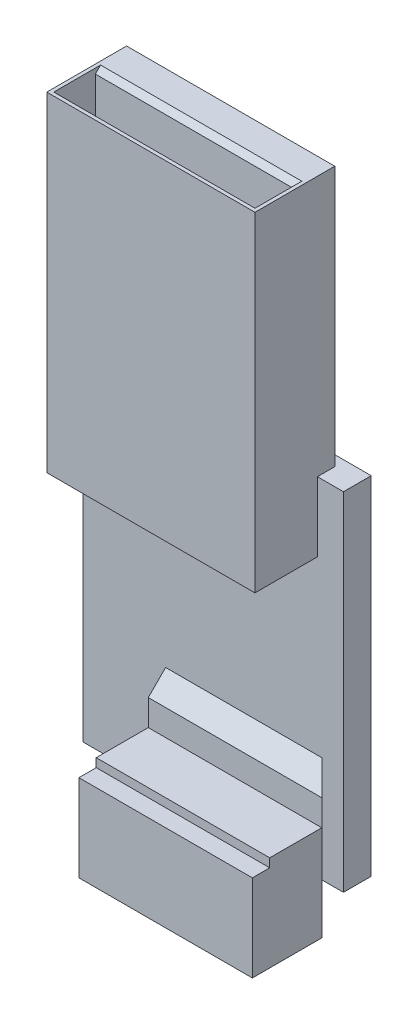
ISO-10303-21;
HEADER;
FILE_DESCRIPTION(('STEP AP214'),'2;1');
FILE_NAME('part.step','',(''),(''),'','','');
FILE_SCHEMA(('AUTOMOTIVE_DESIGN { 1 0 10303 214 1 1 1 1 }'));
ENDSEC;
DATA;
#1=APPLICATION_CONTEXT('core data for automotive mechanical design processes');
#2=APPLICATION_PROTOCOL_DEFINITION('international standard','automotive_design',2000,#1);
#3=PRODUCT_CONTEXT('',#1,'mechanical');
#4=PRODUCT('Part','Part','',(#3));
#5=PRODUCT_RELATED_PRODUCT_CATEGORY('part','',(#4));
#6=PRODUCT_DEFINITION_FORMATION('','',#4);
#7=PRODUCT_DEFINITION_CONTEXT('part definition',#1,'design');
#8=PRODUCT_DEFINITION('design','',#6,#7);
#9=PRODUCT_DEFINITION_SHAPE('','',#8);
#10=(LENGTH_UNIT() NAMED_UNIT(*) SI_UNIT(.MILLI.,.METRE.));
#11=(NAMED_UNIT(*) PLANE_ANGLE_UNIT() SI_UNIT($,.RADIAN.));
#12=(NAMED_UNIT(*) SI_UNIT($,.STERADIAN.) SOLID_ANGLE_UNIT());
#13=UNCERTAINTY_MEASURE_WITH_UNIT(LENGTH_MEASURE(1.E-05),#10,'distance_accuracy_value','');
#14=(GEOMETRIC_REPRESENTATION_CONTEXT(3) GLOBAL_UNCERTAINTY_ASSIGNED_CONTEXT((#13)) GLOBAL_UNIT_ASSIGNED_CONTEXT((#10,
#11,#12)) REPRESENTATION_CONTEXT('',''));
#15=CARTESIAN_POINT('',(0.,0.,0.));
#16=DIRECTION('',(0.,0.,1.));
#17=DIRECTION('',(1.,0.,0.));
#18=AXIS2_PLACEMENT_3D('',#15,#16,#17);
#19=CARTESIAN_POINT('',(0.,0.,1600.));
#20=DIRECTION('',(0.,0.,1.));
#21=DIRECTION('',(1.,0.,0.));
#22=AXIS2_PLACEMENT_3D('',#19,#20,#21);
#23=PLANE('',#22);
#24=DIRECTION('',(1.,0.,0.));
#25=VECTOR('',#24,1.);
#26=CARTESIAN_POINT('',(7500.,10000.,1600.));
#27=LINE('',#26,#25);
#28=CARTESIAN_POINT('',(6000.,10000.,1600.));
#29=VERTEX_POINT('',#28);
#30=CARTESIAN_POINT('',(7500.,10000.,1600.));
#31=VERTEX_POINT('',#30);
#32=EDGE_CURVE('E386',#29,#31,#27,.T.);
#33=ORIENTED_EDGE('',*,*,#32,.F.);
#34=DIRECTION('',(0.,1.,0.));
#35=VECTOR('',#34,1.);
#36=CARTESIAN_POINT('',(6000.,25000.,1600.));
#37=LINE('',#36,#35);
#38=CARTESIAN_POINT('',(6000.,6000.,1600.));
#39=VERTEX_POINT('',#38);
#40=EDGE_CURVE('E287',#39,#29,#37,.T.);
#41=ORIENTED_EDGE('',*,*,#40,.F.);
#42=DIRECTION('',(1.,0.,0.));
#43=VECTOR('',#42,1.);
#44=CARTESIAN_POINT('',(6000.,6000.,1600.));
#45=LINE('',#44,#43);
#46=CARTESIAN_POINT('',(-6000.,6000.,1600.));
#47=VERTEX_POINT('',#46);
#48=EDGE_CURVE('E264',#47,#39,#45,.T.);
#49=ORIENTED_EDGE('',*,*,#48,.F.);
#50=DIRECTION('',(0.,-1.,0.));
#51=VECTOR('',#50,1.);
#52=CARTESIAN_POINT('',(-6000.,6000.,1600.));
#53=LINE('',#52,#51);
#54=CARTESIAN_POINT('',(-6000.,10000.,1600.));
#55=VERTEX_POINT('',#54);
#56=EDGE_CURVE('E273',#55,#47,#53,.T.);
#57=ORIENTED_EDGE('',*,*,#56,.F.);
#58=CARTESIAN_POINT('',(-7500.,10000.,1600.));
#59=VERTEX_POINT('',#58);
#60=EDGE_CURVE('E381',#59,#55,#27,.T.);
#61=ORIENTED_EDGE('',*,*,#60,.F.);
#62=DIRECTION('',(0.,1.,0.));
#63=VECTOR('',#62,1.);
#64=CARTESIAN_POINT('',(-7500.,10000.,1600.));
#65=LINE('',#64,#63);
#66=CARTESIAN_POINT('',(-7500.,-10000.,1600.));
#67=VERTEX_POINT('',#66);
#68=EDGE_CURVE('E390',#67,#59,#65,.T.);
#69=ORIENTED_EDGE('',*,*,#68,.F.);
#70=DIRECTION('',(-1.,0.,0.));
#71=VECTOR('',#70,1.);
#72=CARTESIAN_POINT('',(-7500.,-10000.,1600.));
#73=LINE('',#72,#71);
#74=CARTESIAN_POINT('',(-2750.,-10000.,1600.));
#75=VERTEX_POINT('',#74);
#76=EDGE_CURVE('E455',#75,#67,#73,.T.);
#77=ORIENTED_EDGE('',*,*,#76,.F.);
#78=DIRECTION('',(0.,-1.,0.));
#79=VECTOR('',#78,1.);
#80=CARTESIAN_POINT('',(-2750.,-6400.,1600.));
#81=LINE('',#80,#79);
#82=CARTESIAN_POINT('',(-2750.,-3900.,1600.));
#83=VERTEX_POINT('',#82);
#84=EDGE_CURVE('E354',#83,#75,#81,.T.);
#85=ORIENTED_EDGE('',*,*,#84,.F.);
#86=DIRECTION('',(-1.,0.,0.));
#87=VECTOR('',#86,1.);
#88=CARTESIAN_POINT('',(-2750.,-3900.,1600.));
#89=LINE('',#88,#87);
#90=CARTESIAN_POINT('',(6250.,-3900.,1600.));
#91=VERTEX_POINT('',#90);
#92=EDGE_CURVE('E409',#91,#83,#89,.T.);
#93=ORIENTED_EDGE('',*,*,#92,.F.);
#94=DIRECTION('',(0.,-1.,0.));
#95=VECTOR('',#94,1.);
#96=CARTESIAN_POINT('',(6250.,-6400.,1600.));
#97=LINE('',#96,#95);
#98=CARTESIAN_POINT('',(6250.,-10000.,1600.));
#99=VERTEX_POINT('',#98);
#100=EDGE_CURVE('E364',#91,#99,#97,.T.);
#101=ORIENTED_EDGE('',*,*,#100,.T.);
#102=CARTESIAN_POINT('',(7500.,-10000.,1600.));
#103=VERTEX_POINT('',#102);
#104=EDGE_CURVE('E448',#103,#99,#73,.T.);
#105=ORIENTED_EDGE('',*,*,#104,.F.);
#106=DIRECTION('',(0.,-1.,0.));
#107=VECTOR('',#106,1.);
#108=CARTESIAN_POINT('',(7500.,-10000.,1600.));
#109=LINE('',#108,#107);
#110=EDGE_CURVE('E385',#31,#103,#109,.T.);
#111=ORIENTED_EDGE('',*,*,#110,.F.);
#112=EDGE_LOOP('',(#33,#41,#49,#57,#61,#69,#77,#85,#93,#101,#105,#111));
#113=FACE_BOUND('',#112,.T.);
#114=ADVANCED_FACE('F41',(#113),#23,.T.);
#115=CARTESIAN_POINT('',(7500.,10000.,0.));
#116=DIRECTION('',(0.,-1.,0.));
#117=DIRECTION('',(0.,0.,-1.));
#118=AXIS2_PLACEMENT_3D('',#115,#116,#117);
#119=PLANE('',#118);
#120=DIRECTION('',(0.,0.,1.));
#121=VECTOR('',#120,1.);
#122=CARTESIAN_POINT('',(-6000.,10000.,1600.));
#123=LINE('',#122,#121);
#124=CARTESIAN_POINT('',(-6000.,10000.,600.));
#125=VERTEX_POINT('',#124);
#126=EDGE_CURVE('E299',#125,#55,#123,.T.);
#127=ORIENTED_EDGE('',*,*,#126,.F.);
#128=DIRECTION('',(-1.,0.,0.));
#129=VECTOR('',#128,1.);
#130=CARTESIAN_POINT('',(-6000.,10000.,600.));
#131=LINE('',#130,#129);
#132=CARTESIAN_POINT('',(6000.,10000.,600.));
#133=VERTEX_POINT('',#132);
#134=EDGE_CURVE('E305',#133,#125,#131,.T.);
#135=ORIENTED_EDGE('',*,*,#134,.F.);
#136=DIRECTION('',(0.,0.,-1.));
#137=VECTOR('',#136,1.);
#138=CARTESIAN_POINT('',(6000.,10000.,600.));
#139=LINE('',#138,#137);
#140=EDGE_CURVE('E309',#29,#133,#139,.T.);
#141=ORIENTED_EDGE('',*,*,#140,.F.);
#142=ORIENTED_EDGE('',*,*,#32,.T.);
#143=DIRECTION('',(0.,0.,1.));
#144=VECTOR('',#143,1.);
#145=CARTESIAN_POINT('',(7500.,10000.,0.));
#146=LINE('',#145,#144);
#147=CARTESIAN_POINT('',(7500.,10000.,0.));
#148=VERTEX_POINT('',#147);
#149=EDGE_CURVE('E399',#148,#31,#146,.T.);
#150=ORIENTED_EDGE('',*,*,#149,.F.);
#151=DIRECTION('',(1.,0.,0.));
#152=VECTOR('',#151,1.);
#153=CARTESIAN_POINT('',(7500.,10000.,0.));
#154=LINE('',#153,#152);
#155=CARTESIAN_POINT('',(-7500.,10000.,-4.44089209850063E-13));
#156=VERTEX_POINT('',#155);
#157=EDGE_CURVE('E771',#156,#148,#154,.T.);
#158=ORIENTED_EDGE('',*,*,#157,.F.);
#159=DIRECTION('',(0.,0.,1.));
#160=VECTOR('',#159,1.);
#161=CARTESIAN_POINT('',(-7500.,10000.,-4.44089209850063E-13));
#162=LINE('',#161,#160);
#163=EDGE_CURVE('E403',#156,#59,#162,.T.);
#164=ORIENTED_EDGE('',*,*,#163,.T.);
#165=ORIENTED_EDGE('',*,*,#60,.T.);
#166=EDGE_LOOP('',(#127,#135,#141,#142,#150,#158,#164,#165));
#167=FACE_BOUND('',#166,.T.);
#168=ADVANCED_FACE('F492',(#167),#119,.F.);
#169=CARTESIAN_POINT('',(0.,-6400.,0.));
#170=DIRECTION('',(0.,-1.,0.));
#171=DIRECTION('',(0.,0.,-1.));
#172=AXIS2_PLACEMENT_3D('',#169,#170,#171);
#173=PLANE('',#172);
#174=DIRECTION('',(0.,0.,-1.));
#175=VECTOR('',#174,1.);
#176=CARTESIAN_POINT('',(-2750.,-6400.,6600.));
#177=LINE('',#176,#175);
#178=CARTESIAN_POINT('',(-2750.,-6400.,5600.));
#179=VERTEX_POINT('',#178);
#180=CARTESIAN_POINT('',(-2750.,-6400.,2600.));
#181=VERTEX_POINT('',#180);
#182=EDGE_CURVE('E324',#179,#181,#177,.T.);
#183=ORIENTED_EDGE('',*,*,#182,.F.);
#184=DIRECTION('',(-1.,0.,0.));
#185=VECTOR('',#184,1.);
#186=CARTESIAN_POINT('',(7500.000025,-6400.,5600.));
#187=LINE('',#186,#185);
#188=CARTESIAN_POINT('',(7250.,-6400.,5600.));
#189=VERTEX_POINT('',#188);
#190=EDGE_CURVE('E262',#189,#179,#187,.T.);
#191=ORIENTED_EDGE('',*,*,#190,.F.);
#192=DIRECTION('',(0.,0.,1.));
#193=VECTOR('',#192,1.);
#194=CARTESIAN_POINT('',(7250.,-6400.,2600.));
#195=LINE('',#194,#193);
#196=CARTESIAN_POINT('',(7250.,-6400.,2600.));
#197=VERTEX_POINT('',#196);
#198=EDGE_CURVE('E329',#197,#189,#195,.T.);
#199=ORIENTED_EDGE('',*,*,#198,.F.);
#200=DIRECTION('',(1.,0.,0.));
#201=VECTOR('',#200,1.);
#202=CARTESIAN_POINT('',(7250.,-6400.,2600.));
#203=LINE('',#202,#201);
#204=EDGE_CURVE('E367',#181,#197,#203,.T.);
#205=ORIENTED_EDGE('',*,*,#204,.F.);
#206=EDGE_LOOP('',(#183,#191,#199,#205));
#207=FACE_BOUND('',#206,.T.);
#208=ADVANCED_FACE('F428',(#207),#173,.F.);
#209=CARTESIAN_POINT('',(-2750.,-6400.,1600.));
#210=DIRECTION('',(0.,0.,-1.));
#211=DIRECTION('',(-1.,0.,0.));
#212=AXIS2_PLACEMENT_3D('',#209,#210,#211);
#213=PLANE('',#212);
#214=EDGE_CURVE('E322',#99,#75,#73,.T.);
#215=ORIENTED_EDGE('',*,*,#214,.F.);
#216=CARTESIAN_POINT('',(6250.,-11900.,1600.));
#217=VERTEX_POINT('',#216);
#218=EDGE_CURVE('E328',#99,#217,#97,.T.);
#219=ORIENTED_EDGE('',*,*,#218,.T.);
#220=DIRECTION('',(1.,0.,0.));
#221=VECTOR('',#220,1.);
#222=CARTESIAN_POINT('',(-2750.,-11900.,1600.));
#223=LINE('',#222,#221);
#224=CARTESIAN_POINT('',(-2750.,-11900.,1600.));
#225=VERTEX_POINT('',#224);
#226=EDGE_CURVE('E336',#225,#217,#223,.T.);
#227=ORIENTED_EDGE('',*,*,#226,.F.);
#228=EDGE_CURVE('E357',#75,#225,#81,.T.);
#229=ORIENTED_EDGE('',*,*,#228,.F.);
#230=EDGE_LOOP('',(#215,#219,#227,#229));
#231=FACE_BOUND('',#230,.T.);
#232=ADVANCED_FACE('F471',(#231),#213,.T.);
#233=CARTESIAN_POINT('',(-2750.,-6400.,6600.));
#234=DIRECTION('',(-1.,0.,0.));
#235=DIRECTION('',(0.,0.,1.));
#236=AXIS2_PLACEMENT_3D('',#233,#234,#235);
#237=PLANE('',#236);
#238=DIRECTION('',(0.,-1.,0.));
#239=VECTOR('',#238,1.);
#240=CARTESIAN_POINT('',(-2750.,-6400.,5600.));
#241=LINE('',#240,#239);
#242=CARTESIAN_POINT('',(-2750.,-6900.,5600.));
#243=VERTEX_POINT('',#242);
#244=EDGE_CURVE('E252',#179,#243,#241,.T.);
#245=ORIENTED_EDGE('',*,*,#244,.F.);
#246=ORIENTED_EDGE('',*,*,#182,.T.);
#247=DIRECTION('',(0.,-1.,0.));
#248=VECTOR('',#247,1.);
#249=CARTESIAN_POINT('',(-2750.,-3900.,2600.));
#250=LINE('',#249,#248);
#251=CARTESIAN_POINT('',(-2750.,-4900.00000000001,2600.));
#252=VERTEX_POINT('',#251);
#253=EDGE_CURVE('E374',#252,#181,#250,.T.);
#254=ORIENTED_EDGE('',*,*,#253,.F.);
#255=DIRECTION('',(0.,0.70710678118655,-0.707106781186545));
#256=VECTOR('',#255,1.);
#257=CARTESIAN_POINT('',(-2750.,-7650.00000000001,5349.99999999998));
#258=LINE('',#257,#256);
#259=EDGE_CURVE('E378',#83,#252,#258,.F.);
#260=ORIENTED_EDGE('',*,*,#259,.F.);
#261=ORIENTED_EDGE('',*,*,#84,.T.);
#262=ORIENTED_EDGE('',*,*,#228,.T.);
#263=DIRECTION('',(0.,0.,-1.));
#264=VECTOR('',#263,1.);
#265=CARTESIAN_POINT('',(-2750.,-11900.,6600.));
#266=LINE('',#265,#264);
#267=CARTESIAN_POINT('',(-2750.,-11900.,6600.));
#268=VERTEX_POINT('',#267);
#269=EDGE_CURVE('E350',#268,#225,#266,.T.);
#270=ORIENTED_EDGE('',*,*,#269,.F.);
#271=DIRECTION('',(0.,-1.,0.));
#272=VECTOR('',#271,1.);
#273=CARTESIAN_POINT('',(-2750.,-6400.,6600.));
#274=LINE('',#273,#272);
#275=CARTESIAN_POINT('',(-2750.,-6900.,6600.));
#276=VERTEX_POINT('',#275);
#277=EDGE_CURVE('E358',#276,#268,#274,.T.);
#278=ORIENTED_EDGE('',*,*,#277,.F.);
#279=DIRECTION('',(0.,0.,1.));
#280=VECTOR('',#279,1.);
#281=CARTESIAN_POINT('',(-2750.,-6900.,5600.));
#282=LINE('',#281,#280);
#283=EDGE_CURVE('E259',#243,#276,#282,.T.);
#284=ORIENTED_EDGE('',*,*,#283,.F.);
#285=EDGE_LOOP('',(#245,#246,#254,#260,#261,#262,#270,#278,#284));
#286=FACE_BOUND('',#285,.T.);
#287=ADVANCED_FACE('F467',(#286),#237,.T.);
#288=CARTESIAN_POINT('',(7250.,-6400.,6600.));
#289=DIRECTION('',(0.,0.,1.));
#290=DIRECTION('',(1.,0.,0.));
#291=AXIS2_PLACEMENT_3D('',#288,#289,#290);
#292=PLANE('',#291);
#293=DIRECTION('',(-1.,0.,0.));
#294=VECTOR('',#293,1.);
#295=CARTESIAN_POINT('',(7500.000025,-6900.,6600.));
#296=LINE('',#295,#294);
#297=CARTESIAN_POINT('',(7250.,-6900.,6600.));
#298=VERTEX_POINT('',#297);
#299=EDGE_CURVE('E265',#298,#276,#296,.T.);
#300=ORIENTED_EDGE('',*,*,#299,.T.);
#301=ORIENTED_EDGE('',*,*,#277,.T.);
#302=DIRECTION('',(-1.,0.,0.));
#303=VECTOR('',#302,1.);
#304=CARTESIAN_POINT('',(7250.,-11900.,6600.));
#305=LINE('',#304,#303);
#306=CARTESIAN_POINT('',(7250.,-11900.,6600.));
#307=VERTEX_POINT('',#306);
#308=EDGE_CURVE('E347',#307,#268,#305,.T.);
#309=ORIENTED_EDGE('',*,*,#308,.F.);
#310=DIRECTION('',(0.,-1.,0.));
#311=VECTOR('',#310,1.);
#312=CARTESIAN_POINT('',(7250.,-6400.,6600.));
#313=LINE('',#312,#311);
#314=EDGE_CURVE('E360',#298,#307,#313,.T.);
#315=ORIENTED_EDGE('',*,*,#314,.F.);
#316=EDGE_LOOP('',(#300,#301,#309,#315));
#317=FACE_BOUND('',#316,.T.);
#318=ADVANCED_FACE('F473',(#317),#292,.T.);
#319=CARTESIAN_POINT('',(7250.,-6400.,2600.));
#320=DIRECTION('',(1.,0.,0.));
#321=DIRECTION('',(0.,0.,-1.));
#322=AXIS2_PLACEMENT_3D('',#319,#320,#321);
#323=PLANE('',#322);
#324=DIRECTION('',(0.,1.,0.));
#325=VECTOR('',#324,1.);
#326=CARTESIAN_POINT('',(7250.,-6400.,5600.));
#327=LINE('',#326,#325);
#328=CARTESIAN_POINT('',(7250.,-6900.,5600.));
#329=VERTEX_POINT('',#328);
#330=EDGE_CURVE('E321',#329,#189,#327,.T.);
#331=ORIENTED_EDGE('',*,*,#330,.F.);
#332=DIRECTION('',(0.,0.,-1.));
#333=VECTOR('',#332,1.);
#334=CARTESIAN_POINT('',(7250.,-6900.,2600.));
#335=LINE('',#334,#333);
#336=EDGE_CURVE('E319',#298,#329,#335,.T.);
#337=ORIENTED_EDGE('',*,*,#336,.F.);
#338=ORIENTED_EDGE('',*,*,#314,.T.);
#339=DIRECTION('',(0.,0.,1.));
#340=VECTOR('',#339,1.);
#341=CARTESIAN_POINT('',(7250.,-11900.,2600.));
#342=LINE('',#341,#340);
#343=CARTESIAN_POINT('',(7250.,-11900.,2600.));
#344=VERTEX_POINT('',#343);
#345=EDGE_CURVE('E344',#344,#307,#342,.T.);
#346=ORIENTED_EDGE('',*,*,#345,.F.);
#347=DIRECTION('',(0.,-1.,0.));
#348=VECTOR('',#347,1.);
#349=CARTESIAN_POINT('',(7250.,-6400.,2600.));
#350=LINE('',#349,#348);
#351=EDGE_CURVE('E362',#197,#344,#350,.T.);
#352=ORIENTED_EDGE('',*,*,#351,.F.);
#353=ORIENTED_EDGE('',*,*,#198,.T.);
#354=EDGE_LOOP('',(#331,#337,#338,#346,#352,#353));
#355=FACE_BOUND('',#354,.T.);
#356=ADVANCED_FACE('F433',(#355),#323,.T.);
#357=CARTESIAN_POINT('',(6250.,-6400.,1600.));
#358=DIRECTION('',(0.707106781186548,0.,-0.707106781186548));
#359=DIRECTION('',(-0.707106781186548,0.,-0.707106781186548));
#360=AXIS2_PLACEMENT_3D('',#357,#358,#359);
#361=PLANE('',#360);
#362=DIRECTION('',(0.707106781186547,0.,0.707106781186547));
#363=VECTOR('',#362,1.);
#364=CARTESIAN_POINT('',(6250.,-11900.,1600.));
#365=LINE('',#364,#363);
#366=EDGE_CURVE('E340',#217,#344,#365,.T.);
#367=ORIENTED_EDGE('',*,*,#366,.F.);
#368=ORIENTED_EDGE('',*,*,#218,.F.);
#369=ORIENTED_EDGE('',*,*,#100,.F.);
#370=DIRECTION('',(0.577350269189625,-0.577350269189629,0.577350269189625));
#371=VECTOR('',#370,1.);
#372=CARTESIAN_POINT('',(7083.33333333334,-4733.33333333334,2433.33333333334));
#373=LINE('',#372,#371);
#374=CARTESIAN_POINT('',(7250.,-4900.00000000001,2600.));
#375=VERTEX_POINT('',#374);
#376=EDGE_CURVE('E411',#375,#91,#373,.F.);
#377=ORIENTED_EDGE('',*,*,#376,.F.);
#378=DIRECTION('',(0.,-1.,0.));
#379=VECTOR('',#378,1.);
#380=CARTESIAN_POINT('',(7250.,-3900.,2600.));
#381=LINE('',#380,#379);
#382=EDGE_CURVE('E341',#375,#197,#381,.T.);
#383=ORIENTED_EDGE('',*,*,#382,.T.);
#384=ORIENTED_EDGE('',*,*,#351,.T.);
#385=EDGE_LOOP('',(#367,#368,#369,#377,#383,#384));
#386=FACE_BOUND('',#385,.T.);
#387=ADVANCED_FACE('F416',(#386),#361,.T.);
#388=CARTESIAN_POINT('',(0.,-11900.,0.));
#389=DIRECTION('',(0.,-1.,0.));
#390=DIRECTION('',(0.,0.,-1.));
#391=AXIS2_PLACEMENT_3D('',#388,#389,#390);
#392=PLANE('',#391);
#393=ORIENTED_EDGE('',*,*,#226,.T.);
#394=ORIENTED_EDGE('',*,*,#366,.T.);
#395=ORIENTED_EDGE('',*,*,#345,.T.);
#396=ORIENTED_EDGE('',*,*,#308,.T.);
#397=ORIENTED_EDGE('',*,*,#269,.T.);
#398=EDGE_LOOP('',(#393,#394,#395,#396,#397));
#399=FACE_BOUND('',#398,.T.);
#400=ADVANCED_FACE('F438',(#399),#392,.T.);
#401=CARTESIAN_POINT('',(7250.,-3900.,2600.));
#402=DIRECTION('',(0.,0.,-1.));
#403=DIRECTION('',(-1.,0.,0.));
#404=AXIS2_PLACEMENT_3D('',#401,#402,#403);
#405=PLANE('',#404);
#406=ORIENTED_EDGE('',*,*,#204,.T.);
#407=ORIENTED_EDGE('',*,*,#382,.F.);
#408=DIRECTION('',(-1.,0.,0.));
#409=VECTOR('',#408,1.);
#410=CARTESIAN_POINT('',(-2750.,-4900.00000000001,2600.));
#411=LINE('',#410,#409);
#412=EDGE_CURVE('E330',#252,#375,#411,.F.);
#413=ORIENTED_EDGE('',*,*,#412,.F.);
#414=ORIENTED_EDGE('',*,*,#253,.T.);
#415=EDGE_LOOP('',(#406,#407,#413,#414));
#416=FACE_BOUND('',#415,.T.);
#417=ADVANCED_FACE('F424',(#416),#405,.F.);
#418=CARTESIAN_POINT('',(-2750.,-3900.,1600.));
#419=DIRECTION('',(0.,0.707106781186545,0.70710678118655));
#420=DIRECTION('',(0.,-0.70710678118655,0.707106781186545));
#421=AXIS2_PLACEMENT_3D('',#418,#419,#420);
#422=PLANE('',#421);
#423=ORIENTED_EDGE('',*,*,#412,.T.);
#424=ORIENTED_EDGE('',*,*,#376,.T.);
#425=ORIENTED_EDGE('',*,*,#92,.T.);
#426=ORIENTED_EDGE('',*,*,#259,.T.);
#427=EDGE_LOOP('',(#423,#424,#425,#426));
#428=FACE_BOUND('',#427,.T.);
#429=ADVANCED_FACE('F513',(#428),#422,.T.);
#430=CARTESIAN_POINT('',(-7500.,-10000.,-4.44089209850063E-13));
#431=DIRECTION('',(0.,1.,0.));
#432=DIRECTION('',(0.,0.,1.));
#433=AXIS2_PLACEMENT_3D('',#430,#431,#432);
#434=PLANE('',#433);
#435=ORIENTED_EDGE('',*,*,#104,.T.);
#436=ORIENTED_EDGE('',*,*,#214,.T.);
#437=ORIENTED_EDGE('',*,*,#76,.T.);
#438=DIRECTION('',(0.,0.,1.));
#439=VECTOR('',#438,1.);
#440=CARTESIAN_POINT('',(-7500.,-10000.,-4.44089209850063E-13));
#441=LINE('',#440,#439);
#442=CARTESIAN_POINT('',(-7500.,-10000.,-4.44089209850063E-13));
#443=VERTEX_POINT('',#442);
#444=EDGE_CURVE('E371',#443,#67,#441,.T.);
#445=ORIENTED_EDGE('',*,*,#444,.F.);
#446=DIRECTION('',(-1.,0.,0.));
#447=VECTOR('',#446,1.);
#448=CARTESIAN_POINT('',(-7500.,-10000.,-4.44089209850063E-13));
#449=LINE('',#448,#447);
#450=CARTESIAN_POINT('',(7500.,-10000.,0.));
#451=VERTEX_POINT('',#450);
#452=EDGE_CURVE('E395',#451,#443,#449,.T.);
#453=ORIENTED_EDGE('',*,*,#452,.F.);
#454=DIRECTION('',(0.,0.,1.));
#455=VECTOR('',#454,1.);
#456=CARTESIAN_POINT('',(7500.,-10000.,0.));
#457=LINE('',#456,#455);
#458=EDGE_CURVE('E396',#451,#103,#457,.T.);
#459=ORIENTED_EDGE('',*,*,#458,.T.);
#460=EDGE_LOOP('',(#435,#436,#437,#445,#453,#459));
#461=FACE_BOUND('',#460,.T.);
#462=ADVANCED_FACE('F452',(#461),#434,.F.);
#463=CARTESIAN_POINT('',(-7500.,10000.,-4.44089209850063E-13));
#464=DIRECTION('',(1.,0.,0.));
#465=DIRECTION('',(0.,0.,-1.));
#466=AXIS2_PLACEMENT_3D('',#463,#464,#465);
#467=PLANE('',#466);
#468=ORIENTED_EDGE('',*,*,#68,.T.);
#469=ORIENTED_EDGE('',*,*,#163,.F.);
#470=DIRECTION('',(0.,1.,0.));
#471=VECTOR('',#470,1.);
#472=CARTESIAN_POINT('',(-7500.,10000.,-4.44089209850063E-13));
#473=LINE('',#472,#471);
#474=EDGE_CURVE('E765',#443,#156,#473,.T.);
#475=ORIENTED_EDGE('',*,*,#474,.F.);
#476=ORIENTED_EDGE('',*,*,#444,.T.);
#477=EDGE_LOOP('',(#468,#469,#475,#476));
#478=FACE_BOUND('',#477,.T.);
#479=ADVANCED_FACE('F505',(#478),#467,.F.);
#480=CARTESIAN_POINT('',(7500.,-10000.,0.));
#481=DIRECTION('',(-1.,0.,0.));
#482=DIRECTION('',(0.,-1.,0.));
#483=AXIS2_PLACEMENT_3D('',#480,#481,#482);
#484=PLANE('',#483);
#485=ORIENTED_EDGE('',*,*,#110,.T.);
#486=ORIENTED_EDGE('',*,*,#458,.F.);
#487=DIRECTION('',(0.,-1.,0.));
#488=VECTOR('',#487,1.);
#489=CARTESIAN_POINT('',(7500.,-10000.,0.));
#490=LINE('',#489,#488);
#491=EDGE_CURVE('E400',#148,#451,#490,.T.);
#492=ORIENTED_EDGE('',*,*,#491,.F.);
#493=ORIENTED_EDGE('',*,*,#149,.T.);
#494=EDGE_LOOP('',(#485,#486,#492,#493));
#495=FACE_BOUND('',#494,.T.);
#496=ADVANCED_FACE('F503',(#495),#484,.F.);
#497=CARTESIAN_POINT('',(0.,0.,-2.22044604925031E-13));
#498=DIRECTION('',(0.,0.,1.));
#499=DIRECTION('',(1.,0.,0.));
#500=AXIS2_PLACEMENT_3D('',#497,#498,#499);
#501=PLANE('',#500);
#502=ORIENTED_EDGE('',*,*,#452,.T.);
#503=ORIENTED_EDGE('',*,*,#474,.T.);
#504=ORIENTED_EDGE('',*,*,#157,.T.);
#505=ORIENTED_EDGE('',*,*,#491,.T.);
#506=EDGE_LOOP('',(#502,#503,#504,#505));
#507=FACE_BOUND('',#506,.T.);
#508=ADVANCED_FACE('F501',(#507),#501,.F.);
#509=CARTESIAN_POINT('',(6000.,25000.,600.));
#510=DIRECTION('',(-1.,0.,0.));
#511=DIRECTION('',(0.,0.,1.));
#512=AXIS2_PLACEMENT_3D('',#509,#510,#511);
#513=PLANE('',#512);
#514=ORIENTED_EDGE('',*,*,#140,.T.);
#515=DIRECTION('',(0.,-1.,0.));
#516=VECTOR('',#515,1.);
#517=CARTESIAN_POINT('',(6000.,25000.,600.));
#518=LINE('',#517,#516);
#519=CARTESIAN_POINT('',(6000.,25000.,600.));
#520=VERTEX_POINT('',#519);
#521=EDGE_CURVE('E458',#520,#133,#518,.T.);
#522=ORIENTED_EDGE('',*,*,#521,.F.);
#523=DIRECTION('',(0.,0.,-1.));
#524=VECTOR('',#523,1.);
#525=CARTESIAN_POINT('',(6000.,25000.,600.));
#526=LINE('',#525,#524);
#527=CARTESIAN_POINT('',(6000.,25000.,5200.));
#528=VERTEX_POINT('',#527);
#529=EDGE_CURVE('E296',#528,#520,#526,.T.);
#530=ORIENTED_EDGE('',*,*,#529,.F.);
#531=DIRECTION('',(0.,1.,0.));
#532=VECTOR('',#531,1.);
#533=CARTESIAN_POINT('',(6000.,25000.,5200.));
#534=LINE('',#533,#532);
#535=CARTESIAN_POINT('',(6000.,6000.,5200.));
#536=VERTEX_POINT('',#535);
#537=EDGE_CURVE('E272',#536,#528,#534,.T.);
#538=ORIENTED_EDGE('',*,*,#537,.F.);
#539=DIRECTION('',(0.,0.,-1.));
#540=VECTOR('',#539,1.);
#541=CARTESIAN_POINT('',(6000.,6000.,5200.));
#542=LINE('',#541,#540);
#543=EDGE_CURVE('E785',#536,#39,#542,.T.);
#544=ORIENTED_EDGE('',*,*,#543,.T.);
#545=ORIENTED_EDGE('',*,*,#40,.T.);
#546=EDGE_LOOP('',(#514,#522,#530,#538,#544,#545));
#547=FACE_BOUND('',#546,.T.);
#548=ADVANCED_FACE('F690',(#547),#513,.F.);
#549=CARTESIAN_POINT('',(-6000.,25000.,600.));
#550=DIRECTION('',(0.,0.,1.));
#551=DIRECTION('',(1.,0.,0.));
#552=AXIS2_PLACEMENT_3D('',#549,#550,#551);
#553=PLANE('',#552);
#554=ORIENTED_EDGE('',*,*,#134,.T.);
#555=DIRECTION('',(0.,-1.,0.));
#556=VECTOR('',#555,1.);
#557=CARTESIAN_POINT('',(-6000.,25000.,600.));
#558=LINE('',#557,#556);
#559=CARTESIAN_POINT('',(-6000.,25000.,600.));
#560=VERTEX_POINT('',#559);
#561=EDGE_CURVE('E304',#560,#125,#558,.T.);
#562=ORIENTED_EDGE('',*,*,#561,.F.);
#563=DIRECTION('',(-1.,0.,0.));
#564=VECTOR('',#563,1.);
#565=CARTESIAN_POINT('',(-6000.,25000.,600.));
#566=LINE('',#565,#564);
#567=EDGE_CURVE('E298',#520,#560,#566,.T.);
#568=ORIENTED_EDGE('',*,*,#567,.F.);
#569=ORIENTED_EDGE('',*,*,#521,.T.);
#570=EDGE_LOOP('',(#554,#562,#568,#569));
#571=FACE_BOUND('',#570,.T.);
#572=ADVANCED_FACE('F682',(#571),#553,.F.);
#573=CARTESIAN_POINT('',(-6000.,25000.,1600.));
#574=DIRECTION('',(1.,0.,0.));
#575=DIRECTION('',(0.,0.,-1.));
#576=AXIS2_PLACEMENT_3D('',#573,#574,#575);
#577=PLANE('',#576);
#578=ORIENTED_EDGE('',*,*,#126,.T.);
#579=ORIENTED_EDGE('',*,*,#56,.T.);
#580=DIRECTION('',(0.,0.,-1.));
#581=VECTOR('',#580,1.);
#582=CARTESIAN_POINT('',(-6000.,6000.,5200.));
#583=LINE('',#582,#581);
#584=CARTESIAN_POINT('',(-6000.,6000.,5200.));
#585=VERTEX_POINT('',#584);
#586=EDGE_CURVE('E283',#585,#47,#583,.T.);
#587=ORIENTED_EDGE('',*,*,#586,.F.);
#588=DIRECTION('',(0.,-1.,0.));
#589=VECTOR('',#588,1.);
#590=CARTESIAN_POINT('',(-6000.,6000.,5200.));
#591=LINE('',#590,#589);
#592=CARTESIAN_POINT('',(-6000.,25000.,5200.));
#593=VERTEX_POINT('',#592);
#594=EDGE_CURVE('E280',#593,#585,#591,.T.);
#595=ORIENTED_EDGE('',*,*,#594,.F.);
#596=DIRECTION('',(0.,0.,1.));
#597=VECTOR('',#596,1.);
#598=CARTESIAN_POINT('',(-6000.,25000.,1600.));
#599=LINE('',#598,#597);
#600=EDGE_CURVE('E301',#560,#593,#599,.T.);
#601=ORIENTED_EDGE('',*,*,#600,.F.);
#602=ORIENTED_EDGE('',*,*,#561,.T.);
#603=EDGE_LOOP('',(#578,#579,#587,#595,#601,#602));
#604=FACE_BOUND('',#603,.T.);
#605=ADVANCED_FACE('F591',(#604),#577,.F.);
#606=CARTESIAN_POINT('',(0.,25000.,0.));
#607=DIRECTION('',(0.,-1.,0.));
#608=DIRECTION('',(0.,0.,-1.));
#609=AXIS2_PLACEMENT_3D('',#606,#607,#608);
#610=PLANE('',#609);
#611=DIRECTION('',(0.,0.,1.));
#612=VECTOR('',#611,1.);
#613=CARTESIAN_POINT('',(-5800.,25000.,2600.));
#614=LINE('',#613,#612);
#615=CARTESIAN_POINT('',(-5800.,25000.,2300.));
#616=VERTEX_POINT('',#615);
#617=CARTESIAN_POINT('',(-5800.,25000.,5000.));
#618=VERTEX_POINT('',#617);
#619=EDGE_CURVE('E56',#616,#618,#614,.T.);
#620=ORIENTED_EDGE('',*,*,#619,.F.);
#621=DIRECTION('',(1.,0.,0.));
#622=VECTOR('',#621,1.);
#623=CARTESIAN_POINT('',(0.,25000.,2300.));
#624=LINE('',#623,#622);
#625=CARTESIAN_POINT('',(5800.,25000.,2300.));
#626=VERTEX_POINT('',#625);
#627=EDGE_CURVE('E537',#616,#626,#624,.T.);
#628=ORIENTED_EDGE('',*,*,#627,.T.);
#629=DIRECTION('',(0.,0.,-1.));
#630=VECTOR('',#629,1.);
#631=CARTESIAN_POINT('',(5800.,25000.,5000.));
#632=LINE('',#631,#630);
#633=CARTESIAN_POINT('',(5800.,25000.,5000.));
#634=VERTEX_POINT('',#633);
#635=EDGE_CURVE('E63',#634,#626,#632,.T.);
#636=ORIENTED_EDGE('',*,*,#635,.F.);
#637=DIRECTION('',(1.,0.,0.));
#638=VECTOR('',#637,1.);
#639=CARTESIAN_POINT('',(-5800.,25000.,5000.));
#640=LINE('',#639,#638);
#641=EDGE_CURVE('E239',#618,#634,#640,.T.);
#642=ORIENTED_EDGE('',*,*,#641,.F.);
#643=EDGE_LOOP('',(#620,#628,#636,#642));
#644=FACE_BOUND('',#643,.T.);
#645=ORIENTED_EDGE('',*,*,#600,.T.);
#646=DIRECTION('',(-1.,0.,0.));
#647=VECTOR('',#646,1.);
#648=CARTESIAN_POINT('',(-6000.,25000.,5200.));
#649=LINE('',#648,#647);
#650=EDGE_CURVE('E276',#528,#593,#649,.T.);
#651=ORIENTED_EDGE('',*,*,#650,.F.);
#652=ORIENTED_EDGE('',*,*,#529,.T.);
#653=ORIENTED_EDGE('',*,*,#567,.T.);
#654=EDGE_LOOP('',(#645,#651,#652,#653));
#655=FACE_BOUND('',#654,.T.);
#656=ADVANCED_FACE('F541',(#644,#655),#610,.F.);
#657=CARTESIAN_POINT('',(6000.,6000.,5200.));
#658=DIRECTION('',(0.,1.,0.));
#659=DIRECTION('',(0.,0.,1.));
#660=AXIS2_PLACEMENT_3D('',#657,#658,#659);
#661=PLANE('',#660);
#662=ORIENTED_EDGE('',*,*,#48,.T.);
#663=ORIENTED_EDGE('',*,*,#543,.F.);
#664=DIRECTION('',(1.,0.,0.));
#665=VECTOR('',#664,1.);
#666=CARTESIAN_POINT('',(6000.,6000.,5200.));
#667=LINE('',#666,#665);
#668=EDGE_CURVE('E269',#585,#536,#667,.T.);
#669=ORIENTED_EDGE('',*,*,#668,.F.);
#670=ORIENTED_EDGE('',*,*,#586,.T.);
#671=EDGE_LOOP('',(#662,#663,#669,#670));
#672=FACE_BOUND('',#671,.T.);
#673=ADVANCED_FACE('F488',(#672),#661,.F.);
#674=CARTESIAN_POINT('',(0.,0.,5200.));
#675=DIRECTION('',(0.,0.,-1.));
#676=DIRECTION('',(-1.,0.,0.));
#677=AXIS2_PLACEMENT_3D('',#674,#675,#676);
#678=PLANE('',#677);
#679=ORIENTED_EDGE('',*,*,#668,.T.);
#680=ORIENTED_EDGE('',*,*,#537,.T.);
#681=ORIENTED_EDGE('',*,*,#650,.T.);
#682=ORIENTED_EDGE('',*,*,#594,.T.);
#683=EDGE_LOOP('',(#679,#680,#681,#682));
#684=FACE_BOUND('',#683,.T.);
#685=ADVANCED_FACE('F481',(#684),#678,.F.);
#686=CARTESIAN_POINT('',(7500.000025,-6400.,5600.));
#687=DIRECTION('',(0.,0.,-1.));
#688=DIRECTION('',(-1.,0.,0.));
#689=AXIS2_PLACEMENT_3D('',#686,#687,#688);
#690=PLANE('',#689);
#691=ORIENTED_EDGE('',*,*,#330,.T.);
#692=ORIENTED_EDGE('',*,*,#190,.T.);
#693=ORIENTED_EDGE('',*,*,#244,.T.);
#694=DIRECTION('',(-1.,0.,0.));
#695=VECTOR('',#694,1.);
#696=CARTESIAN_POINT('',(7500.000025,-6900.,5600.));
#697=LINE('',#696,#695);
#698=EDGE_CURVE('E261',#329,#243,#697,.T.);
#699=ORIENTED_EDGE('',*,*,#698,.F.);
#700=EDGE_LOOP('',(#691,#692,#693,#699));
#701=FACE_BOUND('',#700,.T.);
#702=ADVANCED_FACE('F479',(#701),#690,.F.);
#703=CARTESIAN_POINT('',(7500.000025,-6900.,5600.));
#704=DIRECTION('',(0.,-1.,0.));
#705=DIRECTION('',(0.,0.,-1.));
#706=AXIS2_PLACEMENT_3D('',#703,#704,#705);
#707=PLANE('',#706);
#708=ORIENTED_EDGE('',*,*,#336,.T.);
#709=ORIENTED_EDGE('',*,*,#698,.T.);
#710=ORIENTED_EDGE('',*,*,#283,.T.);
#711=ORIENTED_EDGE('',*,*,#299,.F.);
#712=EDGE_LOOP('',(#708,#709,#710,#711));
#713=FACE_BOUND('',#712,.T.);
#714=ADVANCED_FACE('F476',(#713),#707,.F.);
#715=CARTESIAN_POINT('',(5800.,15500.,2600.));
#716=DIRECTION('',(0.,0.,-1.));
#717=DIRECTION('',(-1.,0.,0.));
#718=AXIS2_PLACEMENT_3D('',#715,#716,#717);
#719=PLANE('',#718);
#720=DIRECTION('',(0.,1.,0.));
#721=VECTOR('',#720,1.);
#722=CARTESIAN_POINT('',(5800.,15500.,2600.));
#723=LINE('',#722,#721);
#724=CARTESIAN_POINT('',(5800.,15500.,2600.));
#725=VERTEX_POINT('',#724);
#726=CARTESIAN_POINT('',(5800.,24700.,2600.));
#727=VERTEX_POINT('',#726);
#728=EDGE_CURVE('E250',#725,#727,#723,.T.);
#729=ORIENTED_EDGE('',*,*,#728,.T.);
#730=DIRECTION('',(-1.,0.,0.));
#731=VECTOR('',#730,1.);
#732=CARTESIAN_POINT('',(5800.,24700.,2600.));
#733=LINE('',#732,#731);
#734=CARTESIAN_POINT('',(-5800.,24700.,2600.));
#735=VERTEX_POINT('',#734);
#736=EDGE_CURVE('E221',#727,#735,#733,.T.);
#737=ORIENTED_EDGE('',*,*,#736,.T.);
#738=DIRECTION('',(0.,1.,0.));
#739=VECTOR('',#738,1.);
#740=CARTESIAN_POINT('',(-5800.,15500.,2600.));
#741=LINE('',#740,#739);
#742=CARTESIAN_POINT('',(-5800.,15500.,2600.));
#743=VERTEX_POINT('',#742);
#744=EDGE_CURVE('E213',#743,#735,#741,.T.);
#745=ORIENTED_EDGE('',*,*,#744,.F.);
#746=DIRECTION('',(-1.,0.,0.));
#747=VECTOR('',#746,1.);
#748=CARTESIAN_POINT('',(5800.,15500.,2600.));
#749=LINE('',#748,#747);
#750=EDGE_CURVE('E218',#725,#743,#749,.T.);
#751=ORIENTED_EDGE('',*,*,#750,.F.);
#752=EDGE_LOOP('',(#729,#737,#745,#751));
#753=FACE_BOUND('',#752,.T.);
#754=ADVANCED_FACE('F216',(#753),#719,.F.);
#755=CARTESIAN_POINT('',(5800.,15500.,5000.));
#756=DIRECTION('',(1.,0.,0.));
#757=DIRECTION('',(0.,0.,-1.));
#758=AXIS2_PLACEMENT_3D('',#755,#756,#757);
#759=PLANE('',#758);
#760=ORIENTED_EDGE('',*,*,#635,.T.);
#761=DIRECTION('',(0.,0.707106781186552,-0.707106781186543));
#762=VECTOR('',#761,1.);
#763=CARTESIAN_POINT('',(5800.,18899.9999999999,8399.99999999999));
#764=LINE('',#763,#762);
#765=EDGE_CURVE('E11',#626,#727,#764,.F.);
#766=ORIENTED_EDGE('',*,*,#765,.T.);
#767=ORIENTED_EDGE('',*,*,#728,.F.);
#768=DIRECTION('',(0.,0.,-1.));
#769=VECTOR('',#768,1.);
#770=CARTESIAN_POINT('',(5800.,15500.,5000.));
#771=LINE('',#770,#769);
#772=CARTESIAN_POINT('',(5800.,15500.,5000.));
#773=VERTEX_POINT('',#772);
#774=EDGE_CURVE('E225',#773,#725,#771,.T.);
#775=ORIENTED_EDGE('',*,*,#774,.F.);
#776=DIRECTION('',(0.,1.,0.));
#777=VECTOR('',#776,1.);
#778=CARTESIAN_POINT('',(5800.,15500.,5000.));
#779=LINE('',#778,#777);
#780=EDGE_CURVE('E253',#773,#634,#779,.T.);
#781=ORIENTED_EDGE('',*,*,#780,.T.);
#782=EDGE_LOOP('',(#760,#766,#767,#775,#781));
#783=FACE_BOUND('',#782,.T.);
#784=ADVANCED_FACE('F545',(#783),#759,.F.);
#785=CARTESIAN_POINT('',(-5800.,15500.,5000.));
#786=DIRECTION('',(0.,0.,1.));
#787=DIRECTION('',(1.,0.,0.));
#788=AXIS2_PLACEMENT_3D('',#785,#786,#787);
#789=PLANE('',#788);
#790=ORIENTED_EDGE('',*,*,#641,.T.);
#791=ORIENTED_EDGE('',*,*,#780,.F.);
#792=DIRECTION('',(1.,0.,0.));
#793=VECTOR('',#792,1.);
#794=CARTESIAN_POINT('',(-5800.,15500.,5000.));
#795=LINE('',#794,#793);
#796=CARTESIAN_POINT('',(-5800.,15500.,5000.));
#797=VERTEX_POINT('',#796);
#798=EDGE_CURVE('E234',#797,#773,#795,.T.);
#799=ORIENTED_EDGE('',*,*,#798,.F.);
#800=DIRECTION('',(0.,1.,0.));
#801=VECTOR('',#800,1.);
#802=CARTESIAN_POINT('',(-5800.,15500.,5000.));
#803=LINE('',#802,#801);
#804=EDGE_CURVE('E224',#797,#618,#803,.T.);
#805=ORIENTED_EDGE('',*,*,#804,.T.);
#806=EDGE_LOOP('',(#790,#791,#799,#805));
#807=FACE_BOUND('',#806,.T.);
#808=ADVANCED_FACE('F544',(#807),#789,.F.);
#809=CARTESIAN_POINT('',(-5800.,15500.,2600.));
#810=DIRECTION('',(-1.,0.,0.));
#811=DIRECTION('',(0.,0.,1.));
#812=AXIS2_PLACEMENT_3D('',#809,#810,#811);
#813=PLANE('',#812);
#814=ORIENTED_EDGE('',*,*,#619,.T.);
#815=ORIENTED_EDGE('',*,*,#804,.F.);
#816=DIRECTION('',(0.,0.,1.));
#817=VECTOR('',#816,1.);
#818=CARTESIAN_POINT('',(-5800.,15500.,2600.));
#819=LINE('',#818,#817);
#820=EDGE_CURVE('E228',#743,#797,#819,.T.);
#821=ORIENTED_EDGE('',*,*,#820,.F.);
#822=ORIENTED_EDGE('',*,*,#744,.T.);
#823=DIRECTION('',(0.,-0.707106781186552,0.707106781186543));
#824=VECTOR('',#823,1.);
#825=CARTESIAN_POINT('',(-5800.,20099.9999999999,7200.));
#826=LINE('',#825,#824);
#827=EDGE_CURVE('E49',#735,#616,#826,.F.);
#828=ORIENTED_EDGE('',*,*,#827,.T.);
#829=EDGE_LOOP('',(#814,#815,#821,#822,#828));
#830=FACE_BOUND('',#829,.T.);
#831=ADVANCED_FACE('F229',(#830),#813,.F.);
#832=CARTESIAN_POINT('',(0.,15500.,0.));
#833=DIRECTION('',(0.,1.,0.));
#834=DIRECTION('',(0.,0.,1.));
#835=AXIS2_PLACEMENT_3D('',#832,#833,#834);
#836=PLANE('',#835);
#837=ORIENTED_EDGE('',*,*,#750,.T.);
#838=ORIENTED_EDGE('',*,*,#820,.T.);
#839=ORIENTED_EDGE('',*,*,#798,.T.);
#840=ORIENTED_EDGE('',*,*,#774,.T.);
#841=EDGE_LOOP('',(#837,#838,#839,#840));
#842=FACE_BOUND('',#841,.T.);
#843=ADVANCED_FACE('F236',(#842),#836,.T.);
#844=CARTESIAN_POINT('',(5800.,24700.,2600.));
#845=DIRECTION('',(0.,-0.707106781186543,-0.707106781186552));
#846=DIRECTION('',(-1.,0.,0.));
#847=AXIS2_PLACEMENT_3D('',#844,#845,#846);
#848=PLANE('',#847);
#849=ORIENTED_EDGE('',*,*,#765,.F.);
#850=ORIENTED_EDGE('',*,*,#627,.F.);
#851=ORIENTED_EDGE('',*,*,#827,.F.);
#852=ORIENTED_EDGE('',*,*,#736,.F.);
#853=EDGE_LOOP('',(#849,#850,#851,#852));
#854=FACE_BOUND('',#853,.T.);
#855=ADVANCED_FACE('F43',(#854),#848,.F.);
#856=CLOSED_SHELL('',(#114,#168,#208,#232,#287,#318,#356,#387,#400,#417,#429,#462,#479,#496,
#508,#548,#572,#605,#656,#673,#685,#702,#714,#754,#784,#808,#831,#843,#855));
#857=MANIFOLD_SOLID_BREP('B2',#856);
#858=ADVANCED_BREP_SHAPE_REPRESENTATION('',(#18,#857),#14);
#859=SHAPE_DEFINITION_REPRESENTATION(#9,#858);
ENDSEC;
END-ISO-10303-21;
